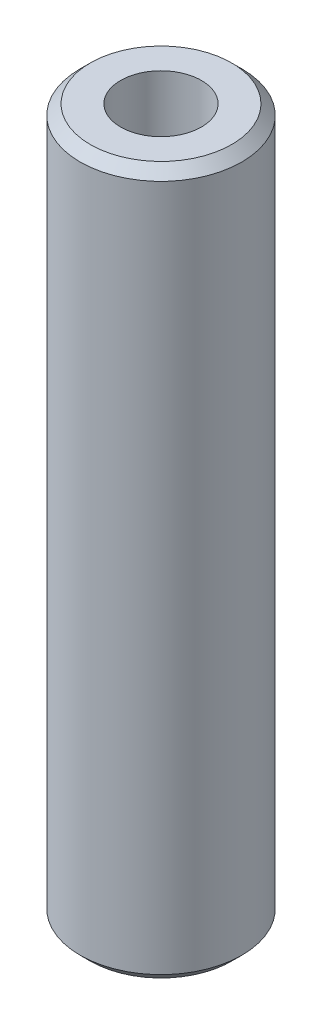
ISO-10303-21;
HEADER;
FILE_DESCRIPTION(('STEP AP214'),'2;1');
FILE_NAME('part.step','',(''),(''),'','','');
FILE_SCHEMA(('AUTOMOTIVE_DESIGN { 1 0 10303 214 1 1 1 1 }'));
ENDSEC;
DATA;
#1=APPLICATION_CONTEXT('core data for automotive mechanical design processes');
#2=APPLICATION_PROTOCOL_DEFINITION('international standard','automotive_design',2000,#1);
#3=PRODUCT_CONTEXT('',#1,'mechanical');
#4=PRODUCT('Part','Part','',(#3));
#5=PRODUCT_RELATED_PRODUCT_CATEGORY('part','',(#4));
#6=PRODUCT_DEFINITION_FORMATION('','',#4);
#7=PRODUCT_DEFINITION_CONTEXT('part definition',#1,'design');
#8=PRODUCT_DEFINITION('design','',#6,#7);
#9=PRODUCT_DEFINITION_SHAPE('','',#8);
#10=(LENGTH_UNIT() NAMED_UNIT(*) SI_UNIT(.MILLI.,.METRE.));
#11=(NAMED_UNIT(*) PLANE_ANGLE_UNIT() SI_UNIT($,.RADIAN.));
#12=(NAMED_UNIT(*) SI_UNIT($,.STERADIAN.) SOLID_ANGLE_UNIT());
#13=UNCERTAINTY_MEASURE_WITH_UNIT(LENGTH_MEASURE(1.E-05),#10,'distance_accuracy_value','');
#14=(GEOMETRIC_REPRESENTATION_CONTEXT(3) GLOBAL_UNCERTAINTY_ASSIGNED_CONTEXT((#13)) GLOBAL_UNIT_ASSIGNED_CONTEXT((#10,
#11,#12)) REPRESENTATION_CONTEXT('',''));
#15=CARTESIAN_POINT('',(0.,0.,0.));
#16=DIRECTION('',(0.,0.,1.));
#17=DIRECTION('',(1.,0.,0.));
#18=AXIS2_PLACEMENT_3D('',#15,#16,#17);
#19=CARTESIAN_POINT('',(0.,35.,0.));
#20=DIRECTION('',(0.,1.,0.));
#21=DIRECTION('',(0.,0.,1.));
#22=AXIS2_PLACEMENT_3D('',#19,#20,#21);
#23=PLANE('',#22);
#24=CARTESIAN_POINT('',(0.,35.,0.));
#25=DIRECTION('',(0.,1.,0.));
#26=DIRECTION('',(0.,0.,1.));
#27=AXIS2_PLACEMENT_3D('',#24,#25,#26);
#28=CIRCLE('',#27,3.50000000000001);
#29=CARTESIAN_POINT('',(0.,35.,3.50000000000001));
#30=VERTEX_POINT('',#29);
#31=EDGE_CURVE('E10',#30,#30,#28,.T.);
#32=ORIENTED_EDGE('',*,*,#31,.T.);
#33=EDGE_LOOP('',(#32));
#34=FACE_BOUND('',#33,.T.);
#35=CARTESIAN_POINT('',(0.,35.,0.));
#36=DIRECTION('',(0.,1.,0.));
#37=DIRECTION('',(0.,0.,1.));
#38=AXIS2_PLACEMENT_3D('',#35,#36,#37);
#39=CIRCLE('',#38,2.);
#40=CARTESIAN_POINT('',(0.,35.,2.));
#41=VERTEX_POINT('',#40);
#42=EDGE_CURVE('E58',#41,#41,#39,.T.);
#43=ORIENTED_EDGE('',*,*,#42,.F.);
#44=EDGE_LOOP('',(#43));
#45=FACE_BOUND('',#44,.T.);
#46=ADVANCED_FACE('F37',(#34,#45),#23,.T.);
#47=CARTESIAN_POINT('',(0.,0.,0.));
#48=DIRECTION('',(0.,1.,0.));
#49=DIRECTION('',(0.,0.,1.));
#50=AXIS2_PLACEMENT_3D('',#47,#48,#49);
#51=PLANE('',#50);
#52=CARTESIAN_POINT('',(0.,0.,0.));
#53=DIRECTION('',(0.,1.,0.));
#54=DIRECTION('',(0.,0.,1.));
#55=AXIS2_PLACEMENT_3D('',#52,#53,#54);
#56=CIRCLE('',#55,3.49999999999999);
#57=CARTESIAN_POINT('',(0.,0.,3.49999999999999));
#58=VERTEX_POINT('',#57);
#59=EDGE_CURVE('E45',#58,#58,#56,.F.);
#60=ORIENTED_EDGE('',*,*,#59,.T.);
#61=EDGE_LOOP('',(#60));
#62=FACE_BOUND('',#61,.T.);
#63=CARTESIAN_POINT('',(0.,0.,0.));
#64=DIRECTION('',(0.,1.,0.));
#65=DIRECTION('',(0.,0.,1.));
#66=AXIS2_PLACEMENT_3D('',#63,#64,#65);
#67=CIRCLE('',#66,2.);
#68=CARTESIAN_POINT('',(0.,0.,2.));
#69=VERTEX_POINT('',#68);
#70=EDGE_CURVE('E59',#69,#69,#67,.T.);
#71=ORIENTED_EDGE('',*,*,#70,.T.);
#72=EDGE_LOOP('',(#71));
#73=FACE_BOUND('',#72,.T.);
#74=ADVANCED_FACE('F69',(#62,#73),#51,.F.);
#75=CARTESIAN_POINT('',(0.,35.,0.));
#76=DIRECTION('',(0.,-1.,0.));
#77=DIRECTION('',(0.,0.,-1.));
#78=AXIS2_PLACEMENT_3D('',#75,#76,#77);
#79=CYLINDRICAL_SURFACE('',#78,4.);
#80=CARTESIAN_POINT('',(0.,0.500000000000014,0.));
#81=DIRECTION('',(0.,1.,0.));
#82=DIRECTION('',(0.,0.,1.));
#83=AXIS2_PLACEMENT_3D('',#80,#81,#82);
#84=CIRCLE('',#83,4.);
#85=CARTESIAN_POINT('',(0.,0.500000000000014,4.));
#86=VERTEX_POINT('',#85);
#87=EDGE_CURVE('E49',#86,#86,#84,.T.);
#88=ORIENTED_EDGE('',*,*,#87,.T.);
#89=EDGE_LOOP('',(#88));
#90=FACE_BOUND('',#89,.T.);
#91=CARTESIAN_POINT('',(0.,34.5,0.));
#92=DIRECTION('',(0.,1.,0.));
#93=DIRECTION('',(0.,0.,1.));
#94=AXIS2_PLACEMENT_3D('',#91,#92,#93);
#95=CIRCLE('',#94,4.);
#96=CARTESIAN_POINT('',(0.,34.5,4.));
#97=VERTEX_POINT('',#96);
#98=EDGE_CURVE('E53',#97,#97,#95,.F.);
#99=ORIENTED_EDGE('',*,*,#98,.T.);
#100=EDGE_LOOP('',(#99));
#101=FACE_BOUND('',#100,.T.);
#102=ADVANCED_FACE('F74',(#90,#101),#79,.T.);
#103=CARTESIAN_POINT('',(0.,35.,0.));
#104=DIRECTION('',(0.,-1.,0.));
#105=DIRECTION('',(0.,0.,-1.));
#106=AXIS2_PLACEMENT_3D('',#103,#104,#105);
#107=CYLINDRICAL_SURFACE('',#106,2.);
#108=ORIENTED_EDGE('',*,*,#42,.T.);
#109=EDGE_LOOP('',(#108));
#110=FACE_BOUND('',#109,.T.);
#111=ORIENTED_EDGE('',*,*,#70,.F.);
#112=EDGE_LOOP('',(#111));
#113=FACE_BOUND('',#112,.T.);
#114=ADVANCED_FACE('F65',(#110,#113),#107,.F.);
#115=CARTESIAN_POINT('',(0.,0.500000000000014,0.));
#116=DIRECTION('',(0.,1.,0.));
#117=DIRECTION('',(0.,0.,1.));
#118=AXIS2_PLACEMENT_3D('',#115,#116,#117);
#119=CONICAL_SURFACE('',#118,4.,0.785398163397445);
#120=ORIENTED_EDGE('',*,*,#59,.F.);
#121=EDGE_LOOP('',(#120));
#122=FACE_BOUND('',#121,.T.);
#123=ORIENTED_EDGE('',*,*,#87,.F.);
#124=EDGE_LOOP('',(#123));
#125=FACE_BOUND('',#124,.T.);
#126=ADVANCED_FACE('F81',(#122,#125),#119,.T.);
#127=CARTESIAN_POINT('',(0.,35.,0.));
#128=DIRECTION('',(0.,-1.,0.));
#129=DIRECTION('',(0.,0.,-1.));
#130=AXIS2_PLACEMENT_3D('',#127,#128,#129);
#131=CONICAL_SURFACE('',#130,3.50000000000001,0.785398163397441);
#132=ORIENTED_EDGE('',*,*,#98,.F.);
#133=EDGE_LOOP('',(#132));
#134=FACE_BOUND('',#133,.T.);
#135=ORIENTED_EDGE('',*,*,#31,.F.);
#136=EDGE_LOOP('',(#135));
#137=FACE_BOUND('',#136,.T.);
#138=ADVANCED_FACE('F40',(#134,#137),#131,.T.);
#139=CLOSED_SHELL('',(#46,#74,#102,#114,#126,#138));
#140=MANIFOLD_SOLID_BREP('B2',#139);
#141=ADVANCED_BREP_SHAPE_REPRESENTATION('',(#18,#140),#14);
#142=SHAPE_DEFINITION_REPRESENTATION(#9,#141);
ENDSEC;
END-ISO-10303-21;
